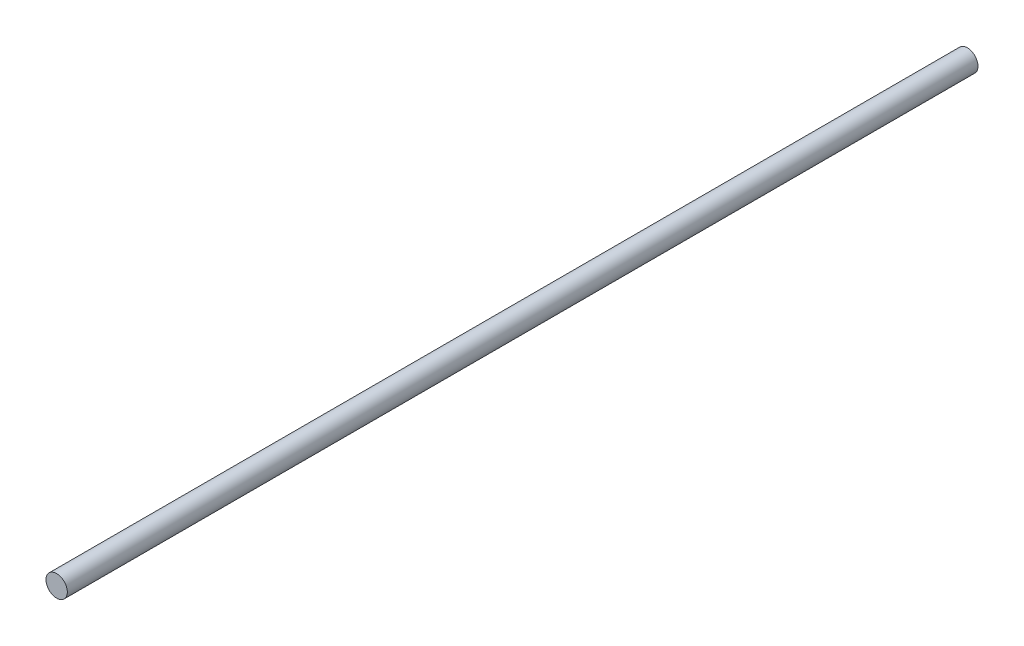
ISO-10303-21;
HEADER;
FILE_DESCRIPTION(('STEP AP214'),'2;1');
FILE_NAME('part.step','',(''),(''),'','','');
FILE_SCHEMA(('AUTOMOTIVE_DESIGN { 1 0 10303 214 1 1 1 1 }'));
ENDSEC;
DATA;
#1=APPLICATION_CONTEXT('core data for automotive mechanical design processes');
#2=APPLICATION_PROTOCOL_DEFINITION('international standard','automotive_design',2000,#1);
#3=PRODUCT_CONTEXT('',#1,'mechanical');
#4=PRODUCT('Part','Part','',(#3));
#5=PRODUCT_RELATED_PRODUCT_CATEGORY('part','',(#4));
#6=PRODUCT_DEFINITION_FORMATION('','',#4);
#7=PRODUCT_DEFINITION_CONTEXT('part definition',#1,'design');
#8=PRODUCT_DEFINITION('design','',#6,#7);
#9=PRODUCT_DEFINITION_SHAPE('','',#8);
#10=(LENGTH_UNIT() NAMED_UNIT(*) SI_UNIT(.MILLI.,.METRE.));
#11=(NAMED_UNIT(*) PLANE_ANGLE_UNIT() SI_UNIT($,.RADIAN.));
#12=(NAMED_UNIT(*) SI_UNIT($,.STERADIAN.) SOLID_ANGLE_UNIT());
#13=UNCERTAINTY_MEASURE_WITH_UNIT(LENGTH_MEASURE(1.E-05),#10,'distance_accuracy_value','');
#14=(GEOMETRIC_REPRESENTATION_CONTEXT(3) GLOBAL_UNCERTAINTY_ASSIGNED_CONTEXT((#13)) GLOBAL_UNIT_ASSIGNED_CONTEXT((#10,
#11,#12)) REPRESENTATION_CONTEXT('',''));
#15=CARTESIAN_POINT('',(0.,0.,0.));
#16=DIRECTION('',(0.,0.,1.));
#17=DIRECTION('',(1.,0.,0.));
#18=AXIS2_PLACEMENT_3D('',#15,#16,#17);
#19=CARTESIAN_POINT('',(0.,0.,256.));
#20=DIRECTION('',(0.,0.,-1.));
#21=DIRECTION('',(-1.,0.,0.));
#22=AXIS2_PLACEMENT_3D('',#19,#20,#21);
#23=CYLINDRICAL_SURFACE('',#22,3.);
#24=CARTESIAN_POINT('',(0.,0.,256.));
#25=DIRECTION('',(0.,0.,1.));
#26=DIRECTION('',(1.,0.,0.));
#27=AXIS2_PLACEMENT_3D('',#24,#25,#26);
#28=CIRCLE('',#27,3.);
#29=CARTESIAN_POINT('',(3.,0.,256.));
#30=VERTEX_POINT('',#29);
#31=EDGE_CURVE('E10',#30,#30,#28,.T.);
#32=ORIENTED_EDGE('',*,*,#31,.F.);
#33=EDGE_LOOP('',(#32));
#34=FACE_BOUND('',#33,.T.);
#35=CARTESIAN_POINT('',(0.,0.,0.));
#36=DIRECTION('',(0.,0.,1.));
#37=DIRECTION('',(1.,0.,0.));
#38=AXIS2_PLACEMENT_3D('',#35,#36,#37);
#39=CIRCLE('',#38,3.);
#40=CARTESIAN_POINT('',(3.,0.,0.));
#41=VERTEX_POINT('',#40);
#42=EDGE_CURVE('E34',#41,#41,#39,.T.);
#43=ORIENTED_EDGE('',*,*,#42,.T.);
#44=EDGE_LOOP('',(#43));
#45=FACE_BOUND('',#44,.T.);
#46=ADVANCED_FACE('F31',(#34,#45),#23,.T.);
#47=CARTESIAN_POINT('',(0.,0.,256.));
#48=DIRECTION('',(0.,0.,1.));
#49=DIRECTION('',(1.,0.,0.));
#50=AXIS2_PLACEMENT_3D('',#47,#48,#49);
#51=PLANE('',#50);
#52=ORIENTED_EDGE('',*,*,#31,.T.);
#53=EDGE_LOOP('',(#52));
#54=FACE_BOUND('',#53,.T.);
#55=ADVANCED_FACE('F46',(#54),#51,.T.);
#56=CARTESIAN_POINT('',(0.,0.,0.));
#57=DIRECTION('',(0.,0.,1.));
#58=DIRECTION('',(1.,0.,0.));
#59=AXIS2_PLACEMENT_3D('',#56,#57,#58);
#60=PLANE('',#59);
#61=ORIENTED_EDGE('',*,*,#42,.F.);
#62=EDGE_LOOP('',(#61));
#63=FACE_BOUND('',#62,.T.);
#64=ADVANCED_FACE('F44',(#63),#60,.F.);
#65=CLOSED_SHELL('',(#46,#55,#64));
#66=MANIFOLD_SOLID_BREP('B2',#65);
#67=ADVANCED_BREP_SHAPE_REPRESENTATION('',(#18,#66),#14);
#68=SHAPE_DEFINITION_REPRESENTATION(#9,#67);
ENDSEC;
END-ISO-10303-21;
